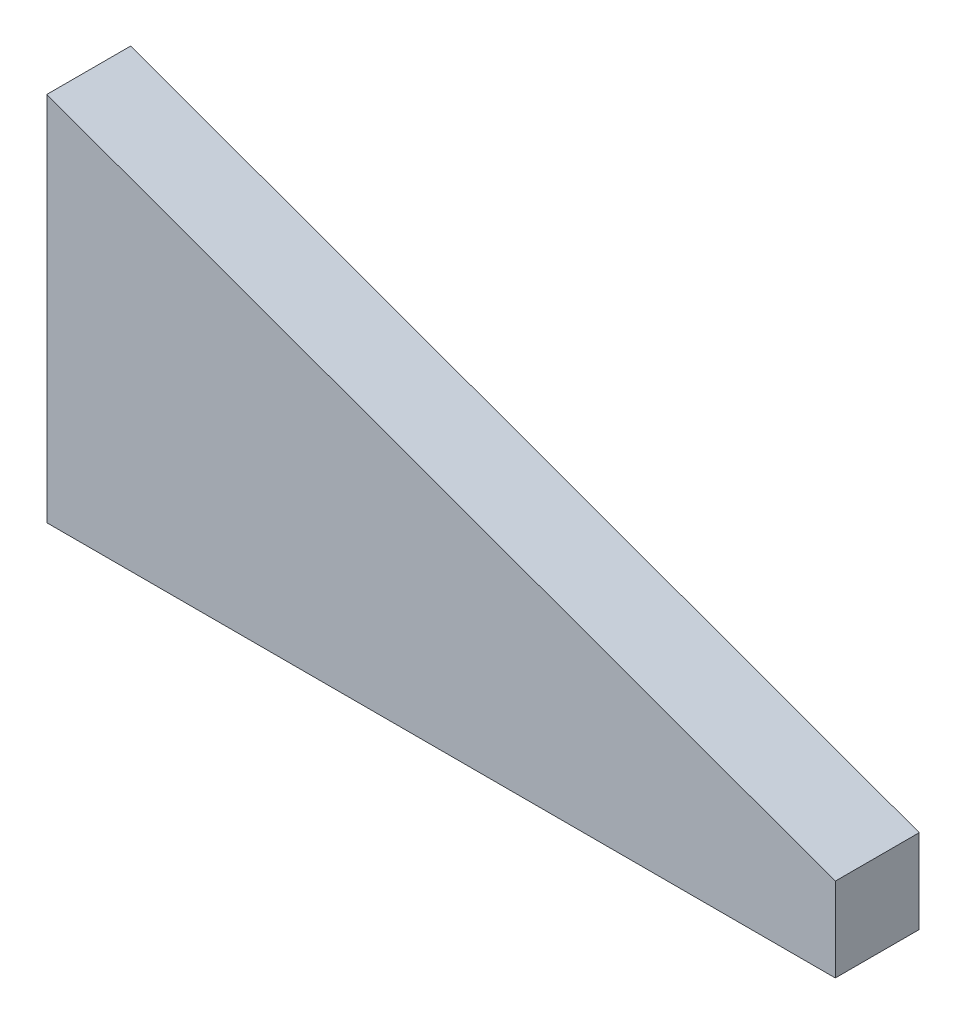
ISO-10303-21;
HEADER;
FILE_DESCRIPTION(('STEP AP214'),'2;1');
FILE_NAME('part.step','',(''),(''),'','','');
FILE_SCHEMA(('AUTOMOTIVE_DESIGN { 1 0 10303 214 1 1 1 1 }'));
ENDSEC;
DATA;
#1=APPLICATION_CONTEXT('core data for automotive mechanical design processes');
#2=APPLICATION_PROTOCOL_DEFINITION('international standard','automotive_design',2000,#1);
#3=PRODUCT_CONTEXT('',#1,'mechanical');
#4=PRODUCT('Part','Part','',(#3));
#5=PRODUCT_RELATED_PRODUCT_CATEGORY('part','',(#4));
#6=PRODUCT_DEFINITION_FORMATION('','',#4);
#7=PRODUCT_DEFINITION_CONTEXT('part definition',#1,'design');
#8=PRODUCT_DEFINITION('design','',#6,#7);
#9=PRODUCT_DEFINITION_SHAPE('','',#8);
#10=(LENGTH_UNIT() NAMED_UNIT(*) SI_UNIT(.MILLI.,.METRE.));
#11=(NAMED_UNIT(*) PLANE_ANGLE_UNIT() SI_UNIT($,.RADIAN.));
#12=(NAMED_UNIT(*) SI_UNIT($,.STERADIAN.) SOLID_ANGLE_UNIT());
#13=UNCERTAINTY_MEASURE_WITH_UNIT(LENGTH_MEASURE(1.E-05),#10,'distance_accuracy_value','');
#14=(GEOMETRIC_REPRESENTATION_CONTEXT(3) GLOBAL_UNCERTAINTY_ASSIGNED_CONTEXT((#13)) GLOBAL_UNIT_ASSIGNED_CONTEXT((#10,
#11,#12)) REPRESENTATION_CONTEXT('',''));
#15=CARTESIAN_POINT('',(0.,0.,0.));
#16=DIRECTION('',(0.,0.,1.));
#17=DIRECTION('',(1.,0.,0.));
#18=AXIS2_PLACEMENT_3D('',#15,#16,#17);
#19=CARTESIAN_POINT('',(-101.345686195653,-26.0298633187961,5.));
#20=DIRECTION('',(0.,1.,0.));
#21=DIRECTION('',(0.,0.,1.));
#22=AXIS2_PLACEMENT_3D('',#19,#20,#21);
#23=PLANE('',#22);
#24=DIRECTION('',(1.,0.,0.));
#25=VECTOR('',#24,1.);
#26=CARTESIAN_POINT('',(-101.345686195653,-26.0298633187961,0.));
#27=LINE('',#26,#25);
#28=CARTESIAN_POINT('',(-101.345686195653,-26.0298633187961,0.));
#29=VERTEX_POINT('',#28);
#30=CARTESIAN_POINT('',(-54.361055156357,-26.0298633187961,0.));
#31=VERTEX_POINT('',#30);
#32=EDGE_CURVE('E87',#29,#31,#27,.T.);
#33=ORIENTED_EDGE('',*,*,#32,.T.);
#34=DIRECTION('',(0.,0.,-1.));
#35=VECTOR('',#34,1.);
#36=CARTESIAN_POINT('',(-54.361055156357,-26.0298633187961,5.));
#37=LINE('',#36,#35);
#38=CARTESIAN_POINT('',(-54.361055156357,-26.0298633187961,5.));
#39=VERTEX_POINT('',#38);
#40=EDGE_CURVE('E41',#39,#31,#37,.T.);
#41=ORIENTED_EDGE('',*,*,#40,.F.);
#42=DIRECTION('',(1.,0.,0.));
#43=VECTOR('',#42,1.);
#44=CARTESIAN_POINT('',(-101.345686195653,-26.0298633187961,5.));
#45=LINE('',#44,#43);
#46=CARTESIAN_POINT('',(-101.345686195653,-26.0298633187961,5.));
#47=VERTEX_POINT('',#46);
#48=EDGE_CURVE('E80',#47,#39,#45,.T.);
#49=ORIENTED_EDGE('',*,*,#48,.F.);
#50=DIRECTION('',(0.,0.,-1.));
#51=VECTOR('',#50,1.);
#52=CARTESIAN_POINT('',(-101.345686195653,-26.0298633187961,5.));
#53=LINE('',#52,#51);
#54=EDGE_CURVE('E11',#47,#29,#53,.T.);
#55=ORIENTED_EDGE('',*,*,#54,.T.);
#56=EDGE_LOOP('',(#33,#41,#49,#55));
#57=FACE_BOUND('',#56,.T.);
#58=ADVANCED_FACE('F33',(#57),#23,.F.);
#59=CARTESIAN_POINT('',(-54.361055156357,-26.0298633187961,5.));
#60=DIRECTION('',(-1.,0.,0.));
#61=DIRECTION('',(0.,0.,1.));
#62=AXIS2_PLACEMENT_3D('',#59,#60,#61);
#63=PLANE('',#62);
#64=DIRECTION('',(0.,1.,0.));
#65=VECTOR('',#64,1.);
#66=CARTESIAN_POINT('',(-54.361055156357,-26.0298633187961,0.));
#67=LINE('',#66,#65);
#68=CARTESIAN_POINT('',(-54.361055156357,-21.0298633187961,0.));
#69=VERTEX_POINT('',#68);
#70=EDGE_CURVE('E67',#31,#69,#67,.T.);
#71=ORIENTED_EDGE('',*,*,#70,.T.);
#72=DIRECTION('',(0.,0.,-1.));
#73=VECTOR('',#72,1.);
#74=CARTESIAN_POINT('',(-54.361055156357,-21.0298633187961,5.));
#75=LINE('',#74,#73);
#76=CARTESIAN_POINT('',(-54.361055156357,-21.0298633187961,5.));
#77=VERTEX_POINT('',#76);
#78=EDGE_CURVE('E88',#77,#69,#75,.T.);
#79=ORIENTED_EDGE('',*,*,#78,.F.);
#80=DIRECTION('',(0.,1.,0.));
#81=VECTOR('',#80,1.);
#82=CARTESIAN_POINT('',(-54.361055156357,-26.0298633187961,5.));
#83=LINE('',#82,#81);
#84=EDGE_CURVE('E84',#39,#77,#83,.T.);
#85=ORIENTED_EDGE('',*,*,#84,.F.);
#86=ORIENTED_EDGE('',*,*,#40,.T.);
#87=EDGE_LOOP('',(#71,#79,#85,#86));
#88=FACE_BOUND('',#87,.T.);
#89=ADVANCED_FACE('F89',(#88),#63,.F.);
#90=CARTESIAN_POINT('',(-54.361055156357,-21.0298633187961,5.));
#91=DIRECTION('',(-0.342020143325663,-0.939692620785911,0.));
#92=DIRECTION('',(0.939692620785911,-0.342020143325663,0.));
#93=AXIS2_PLACEMENT_3D('',#90,#91,#92);
#94=PLANE('',#93);
#95=DIRECTION('',(-0.939692620785911,0.342020143325663,0.));
#96=VECTOR('',#95,1.);
#97=CARTESIAN_POINT('',(-54.361055156357,-21.0298633187961,0.));
#98=LINE('',#97,#96);
#99=CARTESIAN_POINT('',(-101.345686195653,-3.928856152513,0.));
#100=VERTEX_POINT('',#99);
#101=EDGE_CURVE('E74',#69,#100,#98,.T.);
#102=ORIENTED_EDGE('',*,*,#101,.T.);
#103=DIRECTION('',(0.,0.,-1.));
#104=VECTOR('',#103,1.);
#105=CARTESIAN_POINT('',(-101.345686195653,-3.928856152513,5.));
#106=LINE('',#105,#104);
#107=CARTESIAN_POINT('',(-101.345686195653,-3.928856152513,5.));
#108=VERTEX_POINT('',#107);
#109=EDGE_CURVE('E93',#108,#100,#106,.T.);
#110=ORIENTED_EDGE('',*,*,#109,.F.);
#111=DIRECTION('',(-0.939692620785911,0.342020143325663,0.));
#112=VECTOR('',#111,1.);
#113=CARTESIAN_POINT('',(-54.361055156357,-21.0298633187961,5.));
#114=LINE('',#113,#112);
#115=EDGE_CURVE('E91',#77,#108,#114,.T.);
#116=ORIENTED_EDGE('',*,*,#115,.F.);
#117=ORIENTED_EDGE('',*,*,#78,.T.);
#118=EDGE_LOOP('',(#102,#110,#116,#117));
#119=FACE_BOUND('',#118,.T.);
#120=ADVANCED_FACE('F103',(#119),#94,.F.);
#121=CARTESIAN_POINT('',(-101.345686195653,-3.928856152513,5.));
#122=DIRECTION('',(1.,0.,0.));
#123=DIRECTION('',(0.,0.,-1.));
#124=AXIS2_PLACEMENT_3D('',#121,#122,#123);
#125=PLANE('',#124);
#126=DIRECTION('',(0.,-1.,0.));
#127=VECTOR('',#126,1.);
#128=CARTESIAN_POINT('',(-101.345686195653,-3.928856152513,0.));
#129=LINE('',#128,#127);
#130=EDGE_CURVE('E100',#100,#29,#129,.T.);
#131=ORIENTED_EDGE('',*,*,#130,.T.);
#132=ORIENTED_EDGE('',*,*,#54,.F.);
#133=DIRECTION('',(0.,-1.,0.));
#134=VECTOR('',#133,1.);
#135=CARTESIAN_POINT('',(-101.345686195653,-21.0298633187961,5.));
#136=LINE('',#135,#134);
#137=EDGE_CURVE('E49',#108,#47,#136,.T.);
#138=ORIENTED_EDGE('',*,*,#137,.F.);
#139=ORIENTED_EDGE('',*,*,#109,.T.);
#140=EDGE_LOOP('',(#131,#132,#138,#139));
#141=FACE_BOUND('',#140,.T.);
#142=ADVANCED_FACE('F107',(#141),#125,.F.);
#143=CARTESIAN_POINT('',(0.,0.,5.));
#144=DIRECTION('',(0.,0.,1.));
#145=DIRECTION('',(1.,0.,0.));
#146=AXIS2_PLACEMENT_3D('',#143,#144,#145);
#147=PLANE('',#146);
#148=ORIENTED_EDGE('',*,*,#137,.T.);
#149=ORIENTED_EDGE('',*,*,#48,.T.);
#150=ORIENTED_EDGE('',*,*,#84,.T.);
#151=ORIENTED_EDGE('',*,*,#115,.T.);
#152=EDGE_LOOP('',(#148,#149,#150,#151));
#153=FACE_BOUND('',#152,.T.);
#154=ADVANCED_FACE('F82',(#153),#147,.T.);
#155=CARTESIAN_POINT('',(0.,0.,0.));
#156=DIRECTION('',(0.,0.,1.));
#157=DIRECTION('',(1.,0.,0.));
#158=AXIS2_PLACEMENT_3D('',#155,#156,#157);
#159=PLANE('',#158);
#160=ORIENTED_EDGE('',*,*,#32,.F.);
#161=ORIENTED_EDGE('',*,*,#130,.F.);
#162=ORIENTED_EDGE('',*,*,#101,.F.);
#163=ORIENTED_EDGE('',*,*,#70,.F.);
#164=EDGE_LOOP('',(#160,#161,#162,#163));
#165=FACE_BOUND('',#164,.T.);
#166=ADVANCED_FACE('F106',(#165),#159,.F.);
#167=CLOSED_SHELL('',(#58,#89,#120,#142,#154,#166));
#168=MANIFOLD_SOLID_BREP('B2',#167);
#169=ADVANCED_BREP_SHAPE_REPRESENTATION('',(#18,#168),#14);
#170=SHAPE_DEFINITION_REPRESENTATION(#9,#169);
ENDSEC;
END-ISO-10303-21;
